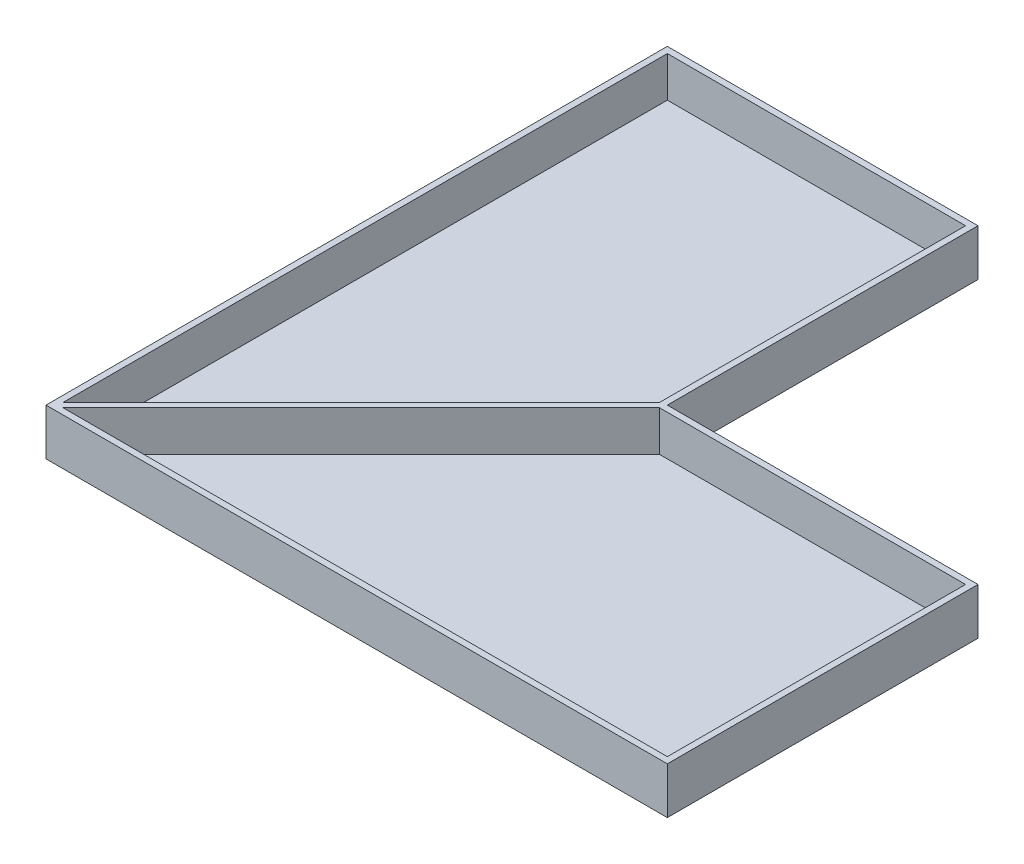
ISO-10303-21;
HEADER;
FILE_DESCRIPTION(('STEP AP214'),'2;1');
FILE_NAME('part.step','',(''),(''),'','','');
FILE_SCHEMA(('AUTOMOTIVE_DESIGN { 1 0 10303 214 1 1 1 1 }'));
ENDSEC;
DATA;
#1=APPLICATION_CONTEXT('core data for automotive mechanical design processes');
#2=APPLICATION_PROTOCOL_DEFINITION('international standard','automotive_design',2000,#1);
#3=PRODUCT_CONTEXT('',#1,'mechanical');
#4=PRODUCT('Part','Part','',(#3));
#5=PRODUCT_RELATED_PRODUCT_CATEGORY('part','',(#4));
#6=PRODUCT_DEFINITION_FORMATION('','',#4);
#7=PRODUCT_DEFINITION_CONTEXT('part definition',#1,'design');
#8=PRODUCT_DEFINITION('design','',#6,#7);
#9=PRODUCT_DEFINITION_SHAPE('','',#8);
#10=(LENGTH_UNIT() NAMED_UNIT(*) SI_UNIT(.MILLI.,.METRE.));
#11=(NAMED_UNIT(*) PLANE_ANGLE_UNIT() SI_UNIT($,.RADIAN.));
#12=(NAMED_UNIT(*) SI_UNIT($,.STERADIAN.) SOLID_ANGLE_UNIT());
#13=UNCERTAINTY_MEASURE_WITH_UNIT(LENGTH_MEASURE(1.E-05),#10,'distance_accuracy_value','');
#14=(GEOMETRIC_REPRESENTATION_CONTEXT(3) GLOBAL_UNCERTAINTY_ASSIGNED_CONTEXT((#13)) GLOBAL_UNIT_ASSIGNED_CONTEXT((#10,
#11,#12)) REPRESENTATION_CONTEXT('',''));
#15=CARTESIAN_POINT('',(0.,0.,0.));
#16=DIRECTION('',(0.,0.,1.));
#17=DIRECTION('',(1.,0.,0.));
#18=AXIS2_PLACEMENT_3D('',#15,#16,#17);
#19=CARTESIAN_POINT('',(0.,20.,0.));
#20=DIRECTION('',(0.,0.,-1.));
#21=DIRECTION('',(1.,0.,0.));
#22=AXIS2_PLACEMENT_3D('',#19,#20,#21);
#23=PLANE('',#22);
#24=DIRECTION('',(-1.,0.,0.));
#25=VECTOR('',#24,1.);
#26=CARTESIAN_POINT('',(0.,0.,0.));
#27=LINE('',#26,#25);
#28=CARTESIAN_POINT('',(2000.,0.,0.));
#29=VERTEX_POINT('',#28);
#30=CARTESIAN_POINT('',(0.,0.,0.));
#31=VERTEX_POINT('',#30);
#32=EDGE_CURVE('E268',#29,#31,#27,.T.);
#33=ORIENTED_EDGE('',*,*,#32,.F.);
#34=DIRECTION('',(0.,-1.,0.));
#35=VECTOR('',#34,1.);
#36=CARTESIAN_POINT('',(2000.,20.,0.));
#37=LINE('',#36,#35);
#38=CARTESIAN_POINT('',(2000.,150.,0.));
#39=VERTEX_POINT('',#38);
#40=EDGE_CURVE('E291',#39,#29,#37,.T.);
#41=ORIENTED_EDGE('',*,*,#40,.F.);
#42=DIRECTION('',(-1.,0.,0.));
#43=VECTOR('',#42,1.);
#44=CARTESIAN_POINT('',(2000.,150.,0.));
#45=LINE('',#44,#43);
#46=CARTESIAN_POINT('',(0.,150.,0.));
#47=VERTEX_POINT('',#46);
#48=EDGE_CURVE('E264',#39,#47,#45,.T.);
#49=ORIENTED_EDGE('',*,*,#48,.T.);
#50=DIRECTION('',(0.,-1.,0.));
#51=VECTOR('',#50,1.);
#52=CARTESIAN_POINT('',(0.,20.,0.));
#53=LINE('',#52,#51);
#54=EDGE_CURVE('E11',#47,#31,#53,.T.);
#55=ORIENTED_EDGE('',*,*,#54,.T.);
#56=EDGE_LOOP('',(#33,#41,#49,#55));
#57=FACE_BOUND('',#56,.T.);
#58=ADVANCED_FACE('F47',(#57),#23,.F.);
#59=CARTESIAN_POINT('',(0.,20.,0.));
#60=DIRECTION('',(1.,0.,0.));
#61=DIRECTION('',(0.,0.,1.));
#62=AXIS2_PLACEMENT_3D('',#59,#60,#61);
#63=PLANE('',#62);
#64=DIRECTION('',(0.,0.,-1.));
#65=VECTOR('',#64,1.);
#66=CARTESIAN_POINT('',(0.,0.,0.));
#67=LINE('',#66,#65);
#68=CARTESIAN_POINT('',(2.44929359829471E-13,0.,-2000.));
#69=VERTEX_POINT('',#68);
#70=EDGE_CURVE('E272',#31,#69,#67,.T.);
#71=ORIENTED_EDGE('',*,*,#70,.F.);
#72=ORIENTED_EDGE('',*,*,#54,.F.);
#73=DIRECTION('',(0.,0.,-1.));
#74=VECTOR('',#73,1.);
#75=CARTESIAN_POINT('',(0.,150.,0.));
#76=LINE('',#75,#74);
#77=CARTESIAN_POINT('',(2.44929359829471E-13,150.,-2000.));
#78=VERTEX_POINT('',#77);
#79=EDGE_CURVE('E245',#47,#78,#76,.T.);
#80=ORIENTED_EDGE('',*,*,#79,.T.);
#81=DIRECTION('',(0.,-1.,0.));
#82=VECTOR('',#81,1.);
#83=CARTESIAN_POINT('',(2.44929359829471E-13,20.,-2000.));
#84=LINE('',#83,#82);
#85=EDGE_CURVE('E55',#78,#69,#84,.T.);
#86=ORIENTED_EDGE('',*,*,#85,.T.);
#87=EDGE_LOOP('',(#71,#72,#80,#86));
#88=FACE_BOUND('',#87,.T.);
#89=ADVANCED_FACE('F310',(#88),#63,.F.);
#90=CARTESIAN_POINT('',(2.44929359829471E-13,20.,-2000.));
#91=DIRECTION('',(0.,0.,1.));
#92=DIRECTION('',(-1.,0.,0.));
#93=AXIS2_PLACEMENT_3D('',#90,#91,#92);
#94=PLANE('',#93);
#95=DIRECTION('',(1.,0.,0.));
#96=VECTOR('',#95,1.);
#97=CARTESIAN_POINT('',(2.44929359829471E-13,0.,-2000.));
#98=LINE('',#97,#96);
#99=CARTESIAN_POINT('',(1000.,0.,-2000.));
#100=VERTEX_POINT('',#99);
#101=EDGE_CURVE('E276',#69,#100,#98,.T.);
#102=ORIENTED_EDGE('',*,*,#101,.F.);
#103=ORIENTED_EDGE('',*,*,#85,.F.);
#104=DIRECTION('',(1.,0.,0.));
#105=VECTOR('',#104,1.);
#106=CARTESIAN_POINT('',(2.44929359829471E-13,150.,-2000.));
#107=LINE('',#106,#105);
#108=CARTESIAN_POINT('',(1000.,150.,-2000.));
#109=VERTEX_POINT('',#108);
#110=EDGE_CURVE('E249',#78,#109,#107,.T.);
#111=ORIENTED_EDGE('',*,*,#110,.T.);
#112=DIRECTION('',(0.,-1.,0.));
#113=VECTOR('',#112,1.);
#114=CARTESIAN_POINT('',(1000.,20.,-2000.));
#115=LINE('',#114,#113);
#116=EDGE_CURVE('E303',#109,#100,#115,.T.);
#117=ORIENTED_EDGE('',*,*,#116,.T.);
#118=EDGE_LOOP('',(#102,#103,#111,#117));
#119=FACE_BOUND('',#118,.T.);
#120=ADVANCED_FACE('F323',(#119),#94,.F.);
#121=CARTESIAN_POINT('',(1000.,20.,-1000.));
#122=DIRECTION('',(-1.,0.,0.));
#123=DIRECTION('',(0.,0.,-1.));
#124=AXIS2_PLACEMENT_3D('',#121,#122,#123);
#125=PLANE('',#124);
#126=DIRECTION('',(0.,0.,1.));
#127=VECTOR('',#126,1.);
#128=CARTESIAN_POINT('',(1000.,0.,-1000.));
#129=LINE('',#128,#127);
#130=CARTESIAN_POINT('',(1000.,0.,-1000.));
#131=VERTEX_POINT('',#130);
#132=EDGE_CURVE('E280',#100,#131,#129,.T.);
#133=ORIENTED_EDGE('',*,*,#132,.F.);
#134=ORIENTED_EDGE('',*,*,#116,.F.);
#135=DIRECTION('',(0.,0.,1.));
#136=VECTOR('',#135,1.);
#137=CARTESIAN_POINT('',(1000.,150.,-2000.));
#138=LINE('',#137,#136);
#139=CARTESIAN_POINT('',(1000.,150.,-1000.));
#140=VERTEX_POINT('',#139);
#141=EDGE_CURVE('E253',#109,#140,#138,.T.);
#142=ORIENTED_EDGE('',*,*,#141,.T.);
#143=DIRECTION('',(0.,-1.,0.));
#144=VECTOR('',#143,1.);
#145=CARTESIAN_POINT('',(1000.,20.,-1000.));
#146=LINE('',#145,#144);
#147=EDGE_CURVE('E299',#140,#131,#146,.T.);
#148=ORIENTED_EDGE('',*,*,#147,.T.);
#149=EDGE_LOOP('',(#133,#134,#142,#148));
#150=FACE_BOUND('',#149,.T.);
#151=ADVANCED_FACE('F325',(#150),#125,.F.);
#152=CARTESIAN_POINT('',(1000.,20.,-1000.));
#153=DIRECTION('',(0.,0.,1.));
#154=DIRECTION('',(-1.,0.,0.));
#155=AXIS2_PLACEMENT_3D('',#152,#153,#154);
#156=PLANE('',#155);
#157=DIRECTION('',(1.,0.,0.));
#158=VECTOR('',#157,1.);
#159=CARTESIAN_POINT('',(1000.,0.,-1000.));
#160=LINE('',#159,#158);
#161=CARTESIAN_POINT('',(2000.,0.,-1000.));
#162=VERTEX_POINT('',#161);
#163=EDGE_CURVE('E284',#131,#162,#160,.T.);
#164=ORIENTED_EDGE('',*,*,#163,.F.);
#165=ORIENTED_EDGE('',*,*,#147,.F.);
#166=DIRECTION('',(1.,0.,0.));
#167=VECTOR('',#166,1.);
#168=CARTESIAN_POINT('',(1000.,150.,-1000.));
#169=LINE('',#168,#167);
#170=CARTESIAN_POINT('',(2000.,150.,-1000.));
#171=VERTEX_POINT('',#170);
#172=EDGE_CURVE('E257',#140,#171,#169,.T.);
#173=ORIENTED_EDGE('',*,*,#172,.T.);
#174=DIRECTION('',(0.,-1.,0.));
#175=VECTOR('',#174,1.);
#176=CARTESIAN_POINT('',(2000.,20.,-1000.));
#177=LINE('',#176,#175);
#178=EDGE_CURVE('E295',#171,#162,#177,.T.);
#179=ORIENTED_EDGE('',*,*,#178,.T.);
#180=EDGE_LOOP('',(#164,#165,#173,#179));
#181=FACE_BOUND('',#180,.T.);
#182=ADVANCED_FACE('F328',(#181),#156,.F.);
#183=CARTESIAN_POINT('',(2000.,20.,0.));
#184=DIRECTION('',(-1.,0.,0.));
#185=DIRECTION('',(0.,0.,-1.));
#186=AXIS2_PLACEMENT_3D('',#183,#184,#185);
#187=PLANE('',#186);
#188=DIRECTION('',(0.,0.,1.));
#189=VECTOR('',#188,1.);
#190=CARTESIAN_POINT('',(2000.,0.,0.));
#191=LINE('',#190,#189);
#192=EDGE_CURVE('E288',#162,#29,#191,.T.);
#193=ORIENTED_EDGE('',*,*,#192,.F.);
#194=ORIENTED_EDGE('',*,*,#178,.F.);
#195=DIRECTION('',(0.,0.,1.));
#196=VECTOR('',#195,1.);
#197=CARTESIAN_POINT('',(2000.,150.,-1000.));
#198=LINE('',#197,#196);
#199=EDGE_CURVE('E261',#171,#39,#198,.T.);
#200=ORIENTED_EDGE('',*,*,#199,.T.);
#201=ORIENTED_EDGE('',*,*,#40,.T.);
#202=EDGE_LOOP('',(#193,#194,#200,#201));
#203=FACE_BOUND('',#202,.T.);
#204=ADVANCED_FACE('F330',(#203),#187,.F.);
#205=CARTESIAN_POINT('',(0.,0.,0.));
#206=DIRECTION('',(0.,-1.,0.));
#207=DIRECTION('',(0.,0.,1.));
#208=AXIS2_PLACEMENT_3D('',#205,#206,#207);
#209=PLANE('',#208);
#210=ORIENTED_EDGE('',*,*,#32,.T.);
#211=ORIENTED_EDGE('',*,*,#70,.T.);
#212=ORIENTED_EDGE('',*,*,#101,.T.);
#213=ORIENTED_EDGE('',*,*,#132,.T.);
#214=ORIENTED_EDGE('',*,*,#163,.T.);
#215=ORIENTED_EDGE('',*,*,#192,.T.);
#216=EDGE_LOOP('',(#210,#211,#212,#213,#214,#215));
#217=FACE_BOUND('',#216,.T.);
#218=ADVANCED_FACE('F314',(#217),#209,.T.);
#219=CARTESIAN_POINT('',(0.,150.,0.));
#220=DIRECTION('',(0.,1.,0.));
#221=DIRECTION('',(0.,0.,-1.));
#222=AXIS2_PLACEMENT_3D('',#219,#220,#221);
#223=PLANE('',#222);
#224=ORIENTED_EDGE('',*,*,#79,.F.);
#225=ORIENTED_EDGE('',*,*,#48,.F.);
#226=ORIENTED_EDGE('',*,*,#199,.F.);
#227=ORIENTED_EDGE('',*,*,#172,.F.);
#228=ORIENTED_EDGE('',*,*,#141,.F.);
#229=ORIENTED_EDGE('',*,*,#110,.F.);
#230=EDGE_LOOP('',(#224,#225,#226,#227,#228,#229));
#231=FACE_BOUND('',#230,.T.);
#232=DIRECTION('',(0.,0.,1.));
#233=VECTOR('',#232,1.);
#234=CARTESIAN_POINT('',(980.,150.,-1980.));
#235=LINE('',#234,#233);
#236=CARTESIAN_POINT('',(980.,150.,-1980.));
#237=VERTEX_POINT('',#236);
#238=CARTESIAN_POINT('',(980.,150.,-994.142135623732));
#239=VERTEX_POINT('',#238);
#240=EDGE_CURVE('E206',#237,#239,#235,.T.);
#241=ORIENTED_EDGE('',*,*,#240,.T.);
#242=DIRECTION('',(-0.707106781186547,0.,0.707106781186548));
#243=VECTOR('',#242,1.);
#244=CARTESIAN_POINT('',(20.,150.,-34.142135623731));
#245=LINE('',#244,#243);
#246=CARTESIAN_POINT('',(20.,150.,-34.142135623731));
#247=VERTEX_POINT('',#246);
#248=EDGE_CURVE('E210',#239,#247,#245,.T.);
#249=ORIENTED_EDGE('',*,*,#248,.T.);
#250=DIRECTION('',(0.,0.,-1.));
#251=VECTOR('',#250,1.);
#252=CARTESIAN_POINT('',(20.,150.,-34.142135623731));
#253=LINE('',#252,#251);
#254=CARTESIAN_POINT('',(20.,150.,-1980.));
#255=VERTEX_POINT('',#254);
#256=EDGE_CURVE('E214',#247,#255,#253,.T.);
#257=ORIENTED_EDGE('',*,*,#256,.T.);
#258=DIRECTION('',(1.,0.,0.));
#259=VECTOR('',#258,1.);
#260=CARTESIAN_POINT('',(20.,150.,-1980.));
#261=LINE('',#260,#259);
#262=EDGE_CURVE('E202',#255,#237,#261,.T.);
#263=ORIENTED_EDGE('',*,*,#262,.T.);
#264=EDGE_LOOP('',(#241,#249,#257,#263));
#265=FACE_BOUND('',#264,.T.);
#266=DIRECTION('',(-1.,0.,0.));
#267=VECTOR('',#266,1.);
#268=CARTESIAN_POINT('',(1980.,150.,-20.));
#269=LINE('',#268,#267);
#270=CARTESIAN_POINT('',(1980.,150.,-20.));
#271=VERTEX_POINT('',#270);
#272=CARTESIAN_POINT('',(34.1421356237314,150.,-20.0000000000001));
#273=VERTEX_POINT('',#272);
#274=EDGE_CURVE('E167',#271,#273,#269,.T.);
#275=ORIENTED_EDGE('',*,*,#274,.T.);
#276=DIRECTION('',(0.707106781186547,0.,-0.707106781186548));
#277=VECTOR('',#276,1.);
#278=CARTESIAN_POINT('',(34.1421356237314,150.,-20.0000000000001));
#279=LINE('',#278,#277);
#280=CARTESIAN_POINT('',(994.142135623731,150.,-980.));
#281=VERTEX_POINT('',#280);
#282=EDGE_CURVE('E176',#273,#281,#279,.T.);
#283=ORIENTED_EDGE('',*,*,#282,.T.);
#284=DIRECTION('',(1.,0.,0.));
#285=VECTOR('',#284,1.);
#286=CARTESIAN_POINT('',(994.142135623731,150.,-980.));
#287=LINE('',#286,#285);
#288=CARTESIAN_POINT('',(1980.,150.,-980.));
#289=VERTEX_POINT('',#288);
#290=EDGE_CURVE('E169',#281,#289,#287,.T.);
#291=ORIENTED_EDGE('',*,*,#290,.T.);
#292=DIRECTION('',(0.,0.,1.));
#293=VECTOR('',#292,1.);
#294=CARTESIAN_POINT('',(1980.,150.,-980.));
#295=LINE('',#294,#293);
#296=EDGE_CURVE('E152',#289,#271,#295,.T.);
#297=ORIENTED_EDGE('',*,*,#296,.T.);
#298=EDGE_LOOP('',(#275,#283,#291,#297));
#299=FACE_BOUND('',#298,.T.);
#300=ADVANCED_FACE('F165',(#231,#265,#299),#223,.T.);
#301=CARTESIAN_POINT('',(20.,150.,-1980.));
#302=DIRECTION('',(0.,0.,1.));
#303=DIRECTION('',(-1.,0.,0.));
#304=AXIS2_PLACEMENT_3D('',#301,#302,#303);
#305=PLANE('',#304);
#306=DIRECTION('',(1.,0.,0.));
#307=VECTOR('',#306,1.);
#308=CARTESIAN_POINT('',(20.,20.,-1980.));
#309=LINE('',#308,#307);
#310=CARTESIAN_POINT('',(20.,20.,-1980.));
#311=VERTEX_POINT('',#310);
#312=CARTESIAN_POINT('',(980.,20.,-1980.));
#313=VERTEX_POINT('',#312);
#314=EDGE_CURVE('E160',#311,#313,#309,.T.);
#315=ORIENTED_EDGE('',*,*,#314,.T.);
#316=DIRECTION('',(0.,-1.,0.));
#317=VECTOR('',#316,1.);
#318=CARTESIAN_POINT('',(980.,150.,-1980.));
#319=LINE('',#318,#317);
#320=EDGE_CURVE('E241',#237,#313,#319,.T.);
#321=ORIENTED_EDGE('',*,*,#320,.F.);
#322=ORIENTED_EDGE('',*,*,#262,.F.);
#323=DIRECTION('',(0.,-1.,0.));
#324=VECTOR('',#323,1.);
#325=CARTESIAN_POINT('',(20.,150.,-1980.));
#326=LINE('',#325,#324);
#327=EDGE_CURVE('E218',#255,#311,#326,.T.);
#328=ORIENTED_EDGE('',*,*,#327,.T.);
#329=EDGE_LOOP('',(#315,#321,#322,#328));
#330=FACE_BOUND('',#329,.T.);
#331=ADVANCED_FACE('F384',(#330),#305,.T.);
#332=CARTESIAN_POINT('',(980.,150.,-1980.));
#333=DIRECTION('',(-1.,0.,0.));
#334=DIRECTION('',(0.,0.,-1.));
#335=AXIS2_PLACEMENT_3D('',#332,#333,#334);
#336=PLANE('',#335);
#337=DIRECTION('',(0.,0.,1.));
#338=VECTOR('',#337,1.);
#339=CARTESIAN_POINT('',(980.,20.,-1980.));
#340=LINE('',#339,#338);
#341=CARTESIAN_POINT('',(980.,20.,-994.142135623732));
#342=VERTEX_POINT('',#341);
#343=EDGE_CURVE('E222',#313,#342,#340,.T.);
#344=ORIENTED_EDGE('',*,*,#343,.T.);
#345=DIRECTION('',(0.,-1.,0.));
#346=VECTOR('',#345,1.);
#347=CARTESIAN_POINT('',(980.,150.,-994.142135623732));
#348=LINE('',#347,#346);
#349=EDGE_CURVE('E237',#239,#342,#348,.T.);
#350=ORIENTED_EDGE('',*,*,#349,.F.);
#351=ORIENTED_EDGE('',*,*,#240,.F.);
#352=ORIENTED_EDGE('',*,*,#320,.T.);
#353=EDGE_LOOP('',(#344,#350,#351,#352));
#354=FACE_BOUND('',#353,.T.);
#355=ADVANCED_FACE('F393',(#354),#336,.T.);
#356=CARTESIAN_POINT('',(20.,150.,-34.142135623731));
#357=DIRECTION('',(-0.707106781186548,0.,-0.707106781186547));
#358=DIRECTION('',(0.707106781186547,0.,-0.707106781186548));
#359=AXIS2_PLACEMENT_3D('',#356,#357,#358);
#360=PLANE('',#359);
#361=DIRECTION('',(-0.707106781186547,0.,0.707106781186548));
#362=VECTOR('',#361,1.);
#363=CARTESIAN_POINT('',(20.,20.,-34.142135623731));
#364=LINE('',#363,#362);
#365=CARTESIAN_POINT('',(20.,20.,-34.142135623731));
#366=VERTEX_POINT('',#365);
#367=EDGE_CURVE('E226',#342,#366,#364,.T.);
#368=ORIENTED_EDGE('',*,*,#367,.T.);
#369=DIRECTION('',(0.,-1.,0.));
#370=VECTOR('',#369,1.);
#371=CARTESIAN_POINT('',(20.,150.,-34.142135623731));
#372=LINE('',#371,#370);
#373=EDGE_CURVE('E234',#247,#366,#372,.T.);
#374=ORIENTED_EDGE('',*,*,#373,.F.);
#375=ORIENTED_EDGE('',*,*,#248,.F.);
#376=ORIENTED_EDGE('',*,*,#349,.T.);
#377=EDGE_LOOP('',(#368,#374,#375,#376));
#378=FACE_BOUND('',#377,.T.);
#379=ADVANCED_FACE('F403',(#378),#360,.T.);
#380=CARTESIAN_POINT('',(20.,150.,-34.142135623731));
#381=DIRECTION('',(1.,0.,0.));
#382=DIRECTION('',(0.,0.,1.));
#383=AXIS2_PLACEMENT_3D('',#380,#381,#382);
#384=PLANE('',#383);
#385=DIRECTION('',(0.,0.,-1.));
#386=VECTOR('',#385,1.);
#387=CARTESIAN_POINT('',(20.,20.,-34.142135623731));
#388=LINE('',#387,#386);
#389=EDGE_CURVE('E62',#366,#311,#388,.T.);
#390=ORIENTED_EDGE('',*,*,#389,.T.);
#391=ORIENTED_EDGE('',*,*,#327,.F.);
#392=ORIENTED_EDGE('',*,*,#256,.F.);
#393=ORIENTED_EDGE('',*,*,#373,.T.);
#394=EDGE_LOOP('',(#390,#391,#392,#393));
#395=FACE_BOUND('',#394,.T.);
#396=ADVANCED_FACE('F413',(#395),#384,.T.);
#397=CARTESIAN_POINT('',(1980.,150.,-980.));
#398=DIRECTION('',(-1.,0.,0.));
#399=DIRECTION('',(0.,0.,-1.));
#400=AXIS2_PLACEMENT_3D('',#397,#398,#399);
#401=PLANE('',#400);
#402=DIRECTION('',(0.,0.,1.));
#403=VECTOR('',#402,1.);
#404=CARTESIAN_POINT('',(1980.,20.,-980.));
#405=LINE('',#404,#403);
#406=CARTESIAN_POINT('',(1980.,20.,-980.));
#407=VERTEX_POINT('',#406);
#408=CARTESIAN_POINT('',(1980.,20.,-20.));
#409=VERTEX_POINT('',#408);
#410=EDGE_CURVE('E155',#407,#409,#405,.T.);
#411=ORIENTED_EDGE('',*,*,#410,.T.);
#412=DIRECTION('',(0.,-1.,0.));
#413=VECTOR('',#412,1.);
#414=CARTESIAN_POINT('',(1980.,150.,-20.));
#415=LINE('',#414,#413);
#416=EDGE_CURVE('E149',#271,#409,#415,.T.);
#417=ORIENTED_EDGE('',*,*,#416,.F.);
#418=ORIENTED_EDGE('',*,*,#296,.F.);
#419=DIRECTION('',(0.,-1.,0.));
#420=VECTOR('',#419,1.);
#421=CARTESIAN_POINT('',(1980.,150.,-980.));
#422=LINE('',#421,#420);
#423=EDGE_CURVE('E183',#289,#407,#422,.T.);
#424=ORIENTED_EDGE('',*,*,#423,.T.);
#425=EDGE_LOOP('',(#411,#417,#418,#424));
#426=FACE_BOUND('',#425,.T.);
#427=ADVANCED_FACE('F151',(#426),#401,.T.);
#428=CARTESIAN_POINT('',(1980.,150.,-20.));
#429=DIRECTION('',(0.,0.,-1.));
#430=DIRECTION('',(1.,0.,0.));
#431=AXIS2_PLACEMENT_3D('',#428,#429,#430);
#432=PLANE('',#431);
#433=DIRECTION('',(-1.,0.,0.));
#434=VECTOR('',#433,1.);
#435=CARTESIAN_POINT('',(1980.,20.,-20.));
#436=LINE('',#435,#434);
#437=CARTESIAN_POINT('',(34.1421356237314,20.,-20.0000000000001));
#438=VERTEX_POINT('',#437);
#439=EDGE_CURVE('E186',#409,#438,#436,.T.);
#440=ORIENTED_EDGE('',*,*,#439,.T.);
#441=DIRECTION('',(0.,-1.,0.));
#442=VECTOR('',#441,1.);
#443=CARTESIAN_POINT('',(34.1421356237314,150.,-20.0000000000001));
#444=LINE('',#443,#442);
#445=EDGE_CURVE('E161',#273,#438,#444,.T.);
#446=ORIENTED_EDGE('',*,*,#445,.F.);
#447=ORIENTED_EDGE('',*,*,#274,.F.);
#448=ORIENTED_EDGE('',*,*,#416,.T.);
#449=EDGE_LOOP('',(#440,#446,#447,#448));
#450=FACE_BOUND('',#449,.T.);
#451=ADVANCED_FACE('F172',(#450),#432,.T.);
#452=CARTESIAN_POINT('',(34.1421356237314,150.,-20.0000000000001));
#453=DIRECTION('',(0.707106781186548,0.,0.707106781186547));
#454=DIRECTION('',(-0.707106781186547,0.,0.707106781186548));
#455=AXIS2_PLACEMENT_3D('',#452,#453,#454);
#456=PLANE('',#455);
#457=DIRECTION('',(0.707106781186547,0.,-0.707106781186548));
#458=VECTOR('',#457,1.);
#459=CARTESIAN_POINT('',(34.1421356237314,20.,-20.0000000000001));
#460=LINE('',#459,#458);
#461=CARTESIAN_POINT('',(994.142135623731,20.,-980.));
#462=VERTEX_POINT('',#461);
#463=EDGE_CURVE('E189',#438,#462,#460,.T.);
#464=ORIENTED_EDGE('',*,*,#463,.T.);
#465=DIRECTION('',(0.,-1.,0.));
#466=VECTOR('',#465,1.);
#467=CARTESIAN_POINT('',(994.142135623731,150.,-980.));
#468=LINE('',#467,#466);
#469=EDGE_CURVE('E197',#281,#462,#468,.T.);
#470=ORIENTED_EDGE('',*,*,#469,.F.);
#471=ORIENTED_EDGE('',*,*,#282,.F.);
#472=ORIENTED_EDGE('',*,*,#445,.T.);
#473=EDGE_LOOP('',(#464,#470,#471,#472));
#474=FACE_BOUND('',#473,.T.);
#475=ADVANCED_FACE('F439',(#474),#456,.T.);
#476=CARTESIAN_POINT('',(994.142135623731,150.,-980.));
#477=DIRECTION('',(0.,0.,1.));
#478=DIRECTION('',(-1.,0.,0.));
#479=AXIS2_PLACEMENT_3D('',#476,#477,#478);
#480=PLANE('',#479);
#481=DIRECTION('',(1.,0.,0.));
#482=VECTOR('',#481,1.);
#483=CARTESIAN_POINT('',(994.142135623731,20.,-980.));
#484=LINE('',#483,#482);
#485=EDGE_CURVE('E70',#462,#407,#484,.T.);
#486=ORIENTED_EDGE('',*,*,#485,.T.);
#487=ORIENTED_EDGE('',*,*,#423,.F.);
#488=ORIENTED_EDGE('',*,*,#290,.F.);
#489=ORIENTED_EDGE('',*,*,#469,.T.);
#490=EDGE_LOOP('',(#486,#487,#488,#489));
#491=FACE_BOUND('',#490,.T.);
#492=ADVANCED_FACE('F448',(#491),#480,.T.);
#493=CARTESIAN_POINT('',(0.,20.,0.));
#494=DIRECTION('',(0.,-1.,0.));
#495=DIRECTION('',(0.,0.,1.));
#496=AXIS2_PLACEMENT_3D('',#493,#494,#495);
#497=PLANE('',#496);
#498=ORIENTED_EDGE('',*,*,#389,.F.);
#499=ORIENTED_EDGE('',*,*,#367,.F.);
#500=ORIENTED_EDGE('',*,*,#343,.F.);
#501=ORIENTED_EDGE('',*,*,#314,.F.);
#502=EDGE_LOOP('',(#498,#499,#500,#501));
#503=FACE_BOUND('',#502,.T.);
#504=ADVANCED_FACE('F458',(#503),#497,.F.);
#505=ORIENTED_EDGE('',*,*,#485,.F.);
#506=ORIENTED_EDGE('',*,*,#463,.F.);
#507=ORIENTED_EDGE('',*,*,#439,.F.);
#508=ORIENTED_EDGE('',*,*,#410,.F.);
#509=EDGE_LOOP('',(#505,#506,#507,#508));
#510=FACE_BOUND('',#509,.T.);
#511=ADVANCED_FACE('F467',(#510),#497,.F.);
#512=CLOSED_SHELL('',(#58,#89,#120,#151,#182,#204,#218,#300,#331,#355,#379,#396,#427,#451,#475,
#492,#504,#511));
#513=MANIFOLD_SOLID_BREP('B2',#512);
#514=ADVANCED_BREP_SHAPE_REPRESENTATION('',(#18,#513),#14);
#515=SHAPE_DEFINITION_REPRESENTATION(#9,#514);
ENDSEC;
END-ISO-10303-21;
